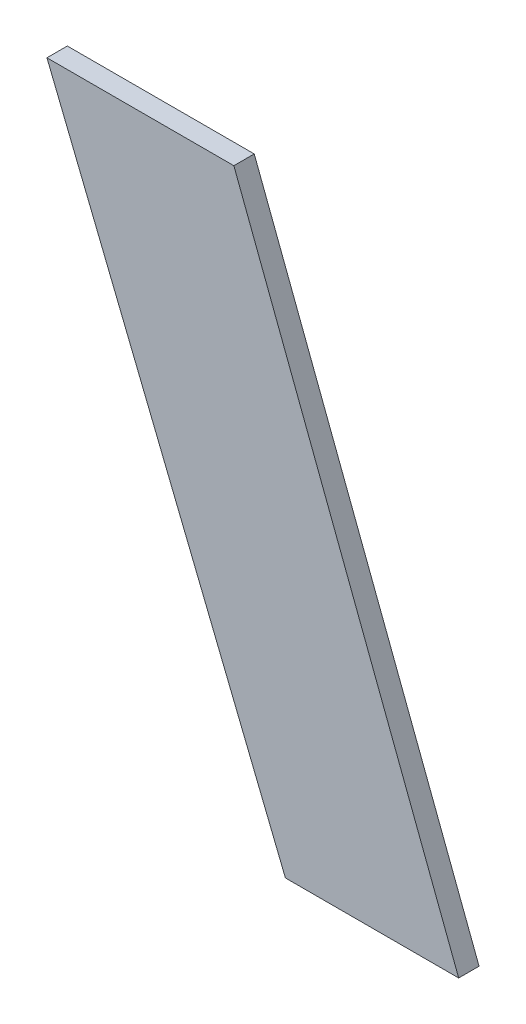
ISO-10303-21;
HEADER;
FILE_DESCRIPTION(('STEP AP214'),'2;1');
FILE_NAME('part.step','',(''),(''),'','','');
FILE_SCHEMA(('AUTOMOTIVE_DESIGN { 1 0 10303 214 1 1 1 1 }'));
ENDSEC;
DATA;
#1=APPLICATION_CONTEXT('core data for automotive mechanical design processes');
#2=APPLICATION_PROTOCOL_DEFINITION('international standard','automotive_design',2000,#1);
#3=PRODUCT_CONTEXT('',#1,'mechanical');
#4=PRODUCT('Part','Part','',(#3));
#5=PRODUCT_RELATED_PRODUCT_CATEGORY('part','',(#4));
#6=PRODUCT_DEFINITION_FORMATION('','',#4);
#7=PRODUCT_DEFINITION_CONTEXT('part definition',#1,'design');
#8=PRODUCT_DEFINITION('design','',#6,#7);
#9=PRODUCT_DEFINITION_SHAPE('','',#8);
#10=(LENGTH_UNIT() NAMED_UNIT(*) SI_UNIT(.MILLI.,.METRE.));
#11=(NAMED_UNIT(*) PLANE_ANGLE_UNIT() SI_UNIT($,.RADIAN.));
#12=(NAMED_UNIT(*) SI_UNIT($,.STERADIAN.) SOLID_ANGLE_UNIT());
#13=UNCERTAINTY_MEASURE_WITH_UNIT(LENGTH_MEASURE(1.E-05),#10,'distance_accuracy_value','');
#14=(GEOMETRIC_REPRESENTATION_CONTEXT(3) GLOBAL_UNCERTAINTY_ASSIGNED_CONTEXT((#13)) GLOBAL_UNIT_ASSIGNED_CONTEXT((#10,
#11,#12)) REPRESENTATION_CONTEXT('',''));
#15=CARTESIAN_POINT('',(0.,0.,0.));
#16=DIRECTION('',(0.,0.,1.));
#17=DIRECTION('',(1.,0.,0.));
#18=AXIS2_PLACEMENT_3D('',#15,#16,#17);
#19=CARTESIAN_POINT('',(-1.82091346153845,-6.50240384615385,0.5));
#20=DIRECTION('',(-0.934665562033205,-0.355528180527443,0.));
#21=DIRECTION('',(0.355528180527443,-0.934665562033205,0.));
#22=AXIS2_PLACEMENT_3D('',#19,#20,#21);
#23=PLANE('',#22);
#24=DIRECTION('',(-0.355528180527443,0.934665562033204,0.));
#25=VECTOR('',#24,1.);
#26=CARTESIAN_POINT('',(-1.82091346153845,-6.50240384615385,0.5));
#27=LINE('',#26,#25);
#28=CARTESIAN_POINT('',(-4.48448854108439,0.5,0.5));
#29=VERTEX_POINT('',#28);
#30=CARTESIAN_POINT('',(-9.99999999999998,15.,0.5));
#31=VERTEX_POINT('',#30);
#32=EDGE_CURVE('E92',#29,#31,#27,.T.);
#33=ORIENTED_EDGE('',*,*,#32,.F.);
#34=DIRECTION('',(0.,0.,-1.));
#35=VECTOR('',#34,1.);
#36=CARTESIAN_POINT('',(-4.48448854108439,0.5,0.5));
#37=LINE('',#36,#35);
#38=CARTESIAN_POINT('',(-4.48448854108439,0.5,0.));
#39=VERTEX_POINT('',#38);
#40=EDGE_CURVE('E53',#29,#39,#37,.T.);
#41=ORIENTED_EDGE('',*,*,#40,.T.);
#42=DIRECTION('',(-0.355528180527443,0.934665562033204,0.));
#43=VECTOR('',#42,1.);
#44=CARTESIAN_POINT('',(-1.82091346153845,-6.50240384615385,0.));
#45=LINE('',#44,#43);
#46=CARTESIAN_POINT('',(-9.99999999999998,15.,0.));
#47=VERTEX_POINT('',#46);
#48=EDGE_CURVE('E88',#39,#47,#45,.T.);
#49=ORIENTED_EDGE('',*,*,#48,.T.);
#50=DIRECTION('',(0.,0.,-1.));
#51=VECTOR('',#50,1.);
#52=CARTESIAN_POINT('',(-9.99999999999998,15.,0.5));
#53=LINE('',#52,#51);
#54=EDGE_CURVE('E48',#31,#47,#53,.T.);
#55=ORIENTED_EDGE('',*,*,#54,.F.);
#56=EDGE_LOOP('',(#33,#41,#49,#55));
#57=FACE_BOUND('',#56,.T.);
#58=ADVANCED_FACE('F39',(#57),#23,.F.);
#59=CARTESIAN_POINT('',(-14.5853365384615,15.,0.5));
#60=DIRECTION('',(0.927370788352332,0.37414358328157,0.));
#61=DIRECTION('',(-0.37414358328157,0.927370788352333,0.));
#62=AXIS2_PLACEMENT_3D('',#59,#60,#61);
#63=PLANE('',#62);
#64=DIRECTION('',(0.37414358328157,-0.927370788352332,0.));
#65=VECTOR('',#64,1.);
#66=CARTESIAN_POINT('',(-14.5853365384615,15.,0.));
#67=LINE('',#66,#65);
#68=CARTESIAN_POINT('',(-14.5853365384615,15.,0.));
#69=VERTEX_POINT('',#68);
#70=CARTESIAN_POINT('',(-8.73537660256409,0.500000000000001,0.));
#71=VERTEX_POINT('',#70);
#72=EDGE_CURVE('E85',#69,#71,#67,.T.);
#73=ORIENTED_EDGE('',*,*,#72,.T.);
#74=DIRECTION('',(0.,0.,1.));
#75=VECTOR('',#74,1.);
#76=CARTESIAN_POINT('',(-8.73537660256408,0.499999999999999,0.5));
#77=LINE('',#76,#75);
#78=CARTESIAN_POINT('',(-8.73537660256409,0.500000000000001,0.5));
#79=VERTEX_POINT('',#78);
#80=EDGE_CURVE('E75',#71,#79,#77,.T.);
#81=ORIENTED_EDGE('',*,*,#80,.T.);
#82=DIRECTION('',(0.37414358328157,-0.927370788352332,0.));
#83=VECTOR('',#82,1.);
#84=CARTESIAN_POINT('',(-14.5853365384615,15.,0.5));
#85=LINE('',#84,#83);
#86=CARTESIAN_POINT('',(-14.5853365384615,15.,0.5));
#87=VERTEX_POINT('',#86);
#88=EDGE_CURVE('E100',#87,#79,#85,.T.);
#89=ORIENTED_EDGE('',*,*,#88,.F.);
#90=DIRECTION('',(0.,0.,-1.));
#91=VECTOR('',#90,1.);
#92=CARTESIAN_POINT('',(-14.5853365384615,15.,0.5));
#93=LINE('',#92,#91);
#94=EDGE_CURVE('E83',#87,#69,#93,.T.);
#95=ORIENTED_EDGE('',*,*,#94,.T.);
#96=EDGE_LOOP('',(#73,#81,#89,#95));
#97=FACE_BOUND('',#96,.T.);
#98=ADVANCED_FACE('F89',(#97),#63,.F.);
#99=CARTESIAN_POINT('',(0.579497032906944,-8.90680562357167,0.5));
#100=DIRECTION('',(0.,0.,-1.));
#101=DIRECTION('',(-1.,0.,0.));
#102=AXIS2_PLACEMENT_3D('',#99,#100,#101);
#103=PLANE('',#102);
#104=ORIENTED_EDGE('',*,*,#88,.T.);
#105=DIRECTION('',(1.,0.,0.));
#106=VECTOR('',#105,1.);
#107=CARTESIAN_POINT('',(0.579497032906944,0.5,0.5));
#108=LINE('',#107,#106);
#109=EDGE_CURVE('E78',#79,#29,#108,.T.);
#110=ORIENTED_EDGE('',*,*,#109,.T.);
#111=ORIENTED_EDGE('',*,*,#32,.T.);
#112=DIRECTION('',(-1.,0.,0.));
#113=VECTOR('',#112,1.);
#114=CARTESIAN_POINT('',(-9.99999999999998,15.,0.5));
#115=LINE('',#114,#113);
#116=EDGE_CURVE('E96',#31,#87,#115,.T.);
#117=ORIENTED_EDGE('',*,*,#116,.T.);
#118=EDGE_LOOP('',(#104,#110,#111,#117));
#119=FACE_BOUND('',#118,.T.);
#120=ADVANCED_FACE('F111',(#119),#103,.F.);
#121=CARTESIAN_POINT('',(0.579497032906944,-8.90680562357167,0.));
#122=DIRECTION('',(0.,0.,-1.));
#123=DIRECTION('',(-1.,0.,0.));
#124=AXIS2_PLACEMENT_3D('',#121,#122,#123);
#125=PLANE('',#124);
#126=DIRECTION('',(1.,0.,0.));
#127=VECTOR('',#126,1.);
#128=CARTESIAN_POINT('',(0.579497032906944,0.5,0.));
#129=LINE('',#128,#127);
#130=EDGE_CURVE('E11',#71,#39,#129,.T.);
#131=ORIENTED_EDGE('',*,*,#130,.F.);
#132=ORIENTED_EDGE('',*,*,#72,.F.);
#133=DIRECTION('',(-1.,0.,0.));
#134=VECTOR('',#133,1.);
#135=CARTESIAN_POINT('',(-9.99999999999998,15.,0.));
#136=LINE('',#135,#134);
#137=EDGE_CURVE('E105',#47,#69,#136,.T.);
#138=ORIENTED_EDGE('',*,*,#137,.F.);
#139=ORIENTED_EDGE('',*,*,#48,.F.);
#140=EDGE_LOOP('',(#131,#132,#138,#139));
#141=FACE_BOUND('',#140,.T.);
#142=ADVANCED_FACE('F41',(#141),#125,.T.);
#143=CARTESIAN_POINT('',(-9.99999999999998,15.,0.5));
#144=DIRECTION('',(0.,-1.,0.));
#145=DIRECTION('',(0.,0.,-1.));
#146=AXIS2_PLACEMENT_3D('',#143,#144,#145);
#147=PLANE('',#146);
#148=ORIENTED_EDGE('',*,*,#137,.T.);
#149=ORIENTED_EDGE('',*,*,#94,.F.);
#150=ORIENTED_EDGE('',*,*,#116,.F.);
#151=ORIENTED_EDGE('',*,*,#54,.T.);
#152=EDGE_LOOP('',(#148,#149,#150,#151));
#153=FACE_BOUND('',#152,.T.);
#154=ADVANCED_FACE('F106',(#153),#147,.F.);
#155=CARTESIAN_POINT('',(-17.,0.5,1.));
#156=DIRECTION('',(0.,1.,0.));
#157=DIRECTION('',(0.,0.,1.));
#158=AXIS2_PLACEMENT_3D('',#155,#156,#157);
#159=PLANE('',#158);
#160=ORIENTED_EDGE('',*,*,#109,.F.);
#161=ORIENTED_EDGE('',*,*,#80,.F.);
#162=ORIENTED_EDGE('',*,*,#130,.T.);
#163=ORIENTED_EDGE('',*,*,#40,.F.);
#164=EDGE_LOOP('',(#160,#161,#162,#163));
#165=FACE_BOUND('',#164,.T.);
#166=ADVANCED_FACE('F73',(#165),#159,.F.);
#167=CLOSED_SHELL('',(#58,#98,#120,#142,#154,#166));
#168=MANIFOLD_SOLID_BREP('B2',#167);
#169=ADVANCED_BREP_SHAPE_REPRESENTATION('',(#18,#168),#14);
#170=SHAPE_DEFINITION_REPRESENTATION(#9,#169);
ENDSEC;
END-ISO-10303-21;
